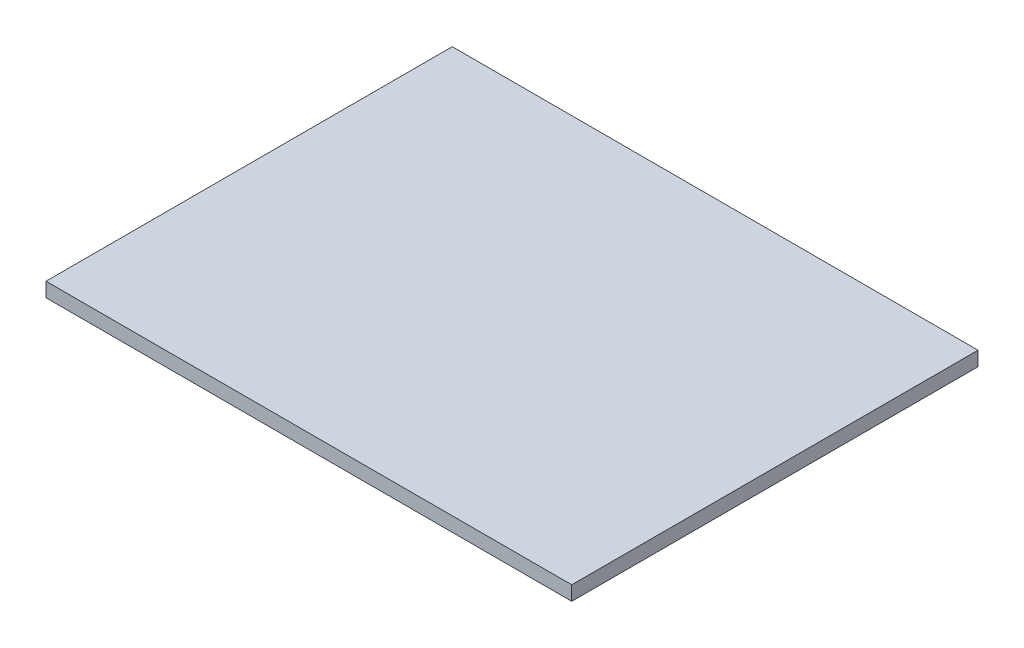
ISO-10303-21;
HEADER;
FILE_DESCRIPTION(('STEP AP214'),'2;1');
FILE_NAME('part.step','',(''),(''),'','','');
FILE_SCHEMA(('AUTOMOTIVE_DESIGN { 1 0 10303 214 1 1 1 1 }'));
ENDSEC;
DATA;
#1=APPLICATION_CONTEXT('core data for automotive mechanical design processes');
#2=APPLICATION_PROTOCOL_DEFINITION('international standard','automotive_design',2000,#1);
#3=PRODUCT_CONTEXT('',#1,'mechanical');
#4=PRODUCT('Part','Part','',(#3));
#5=PRODUCT_RELATED_PRODUCT_CATEGORY('part','',(#4));
#6=PRODUCT_DEFINITION_FORMATION('','',#4);
#7=PRODUCT_DEFINITION_CONTEXT('part definition',#1,'design');
#8=PRODUCT_DEFINITION('design','',#6,#7);
#9=PRODUCT_DEFINITION_SHAPE('','',#8);
#10=(LENGTH_UNIT() NAMED_UNIT(*) SI_UNIT(.MILLI.,.METRE.));
#11=(NAMED_UNIT(*) PLANE_ANGLE_UNIT() SI_UNIT($,.RADIAN.));
#12=(NAMED_UNIT(*) SI_UNIT($,.STERADIAN.) SOLID_ANGLE_UNIT());
#13=UNCERTAINTY_MEASURE_WITH_UNIT(LENGTH_MEASURE(1.E-05),#10,'distance_accuracy_value','');
#14=(GEOMETRIC_REPRESENTATION_CONTEXT(3) GLOBAL_UNCERTAINTY_ASSIGNED_CONTEXT((#13)) GLOBAL_UNIT_ASSIGNED_CONTEXT((#10,
#11,#12)) REPRESENTATION_CONTEXT('',''));
#15=CARTESIAN_POINT('',(0.,0.,0.));
#16=DIRECTION('',(0.,0.,1.));
#17=DIRECTION('',(1.,0.,0.));
#18=AXIS2_PLACEMENT_3D('',#15,#16,#17);
#19=CARTESIAN_POINT('',(55.,3.,42.5));
#20=DIRECTION('',(-1.,0.,0.));
#21=DIRECTION('',(0.,0.,1.));
#22=AXIS2_PLACEMENT_3D('',#19,#20,#21);
#23=PLANE('',#22);
#24=DIRECTION('',(0.,0.,-1.));
#25=VECTOR('',#24,1.);
#26=CARTESIAN_POINT('',(55.,0.,42.5));
#27=LINE('',#26,#25);
#28=CARTESIAN_POINT('',(55.,0.,42.5));
#29=VERTEX_POINT('',#28);
#30=CARTESIAN_POINT('',(55.,0.,-42.5));
#31=VERTEX_POINT('',#30);
#32=EDGE_CURVE('E96',#29,#31,#27,.T.);
#33=ORIENTED_EDGE('',*,*,#32,.T.);
#34=DIRECTION('',(0.,-1.,0.));
#35=VECTOR('',#34,1.);
#36=CARTESIAN_POINT('',(55.,3.,-42.5));
#37=LINE('',#36,#35);
#38=CARTESIAN_POINT('',(55.,3.,-42.5));
#39=VERTEX_POINT('',#38);
#40=EDGE_CURVE('E11',#39,#31,#37,.T.);
#41=ORIENTED_EDGE('',*,*,#40,.F.);
#42=DIRECTION('',(0.,0.,-1.));
#43=VECTOR('',#42,1.);
#44=CARTESIAN_POINT('',(55.,3.,42.5));
#45=LINE('',#44,#43);
#46=CARTESIAN_POINT('',(55.,3.,42.5));
#47=VERTEX_POINT('',#46);
#48=EDGE_CURVE('E84',#47,#39,#45,.T.);
#49=ORIENTED_EDGE('',*,*,#48,.F.);
#50=DIRECTION('',(0.,-1.,0.));
#51=VECTOR('',#50,1.);
#52=CARTESIAN_POINT('',(55.,3.,42.5));
#53=LINE('',#52,#51);
#54=EDGE_CURVE('E92',#47,#29,#53,.T.);
#55=ORIENTED_EDGE('',*,*,#54,.T.);
#56=EDGE_LOOP('',(#33,#41,#49,#55));
#57=FACE_BOUND('',#56,.T.);
#58=ADVANCED_FACE('F33',(#57),#23,.F.);
#59=CARTESIAN_POINT('',(-55.,3.,-42.5));
#60=DIRECTION('',(0.,0.,1.));
#61=DIRECTION('',(1.,0.,0.));
#62=AXIS2_PLACEMENT_3D('',#59,#60,#61);
#63=PLANE('',#62);
#64=DIRECTION('',(-1.,0.,0.));
#65=VECTOR('',#64,1.);
#66=CARTESIAN_POINT('',(-55.,0.,-42.5));
#67=LINE('',#66,#65);
#68=CARTESIAN_POINT('',(-55.,0.,-42.5));
#69=VERTEX_POINT('',#68);
#70=EDGE_CURVE('E88',#31,#69,#67,.T.);
#71=ORIENTED_EDGE('',*,*,#70,.T.);
#72=DIRECTION('',(0.,-1.,0.));
#73=VECTOR('',#72,1.);
#74=CARTESIAN_POINT('',(-55.,3.,-42.5));
#75=LINE('',#74,#73);
#76=CARTESIAN_POINT('',(-55.,3.,-42.5));
#77=VERTEX_POINT('',#76);
#78=EDGE_CURVE('E41',#77,#69,#75,.T.);
#79=ORIENTED_EDGE('',*,*,#78,.F.);
#80=DIRECTION('',(-1.,0.,0.));
#81=VECTOR('',#80,1.);
#82=CARTESIAN_POINT('',(-55.,3.,-42.5));
#83=LINE('',#82,#81);
#84=EDGE_CURVE('E79',#39,#77,#83,.T.);
#85=ORIENTED_EDGE('',*,*,#84,.F.);
#86=ORIENTED_EDGE('',*,*,#40,.T.);
#87=EDGE_LOOP('',(#71,#79,#85,#86));
#88=FACE_BOUND('',#87,.T.);
#89=ADVANCED_FACE('F87',(#88),#63,.F.);
#90=CARTESIAN_POINT('',(-55.,3.,42.5));
#91=DIRECTION('',(1.,0.,0.));
#92=DIRECTION('',(0.,0.,-1.));
#93=AXIS2_PLACEMENT_3D('',#90,#91,#92);
#94=PLANE('',#93);
#95=DIRECTION('',(0.,0.,1.));
#96=VECTOR('',#95,1.);
#97=CARTESIAN_POINT('',(-55.,0.,42.5));
#98=LINE('',#97,#96);
#99=CARTESIAN_POINT('',(-55.,0.,42.5));
#100=VERTEX_POINT('',#99);
#101=EDGE_CURVE('E66',#69,#100,#98,.T.);
#102=ORIENTED_EDGE('',*,*,#101,.T.);
#103=DIRECTION('',(0.,-1.,0.));
#104=VECTOR('',#103,1.);
#105=CARTESIAN_POINT('',(-55.,3.,42.5));
#106=LINE('',#105,#104);
#107=CARTESIAN_POINT('',(-55.,3.,42.5));
#108=VERTEX_POINT('',#107);
#109=EDGE_CURVE('E89',#108,#100,#106,.T.);
#110=ORIENTED_EDGE('',*,*,#109,.F.);
#111=DIRECTION('',(0.,0.,1.));
#112=VECTOR('',#111,1.);
#113=CARTESIAN_POINT('',(-55.,3.,42.5));
#114=LINE('',#113,#112);
#115=EDGE_CURVE('E82',#77,#108,#114,.T.);
#116=ORIENTED_EDGE('',*,*,#115,.F.);
#117=ORIENTED_EDGE('',*,*,#78,.T.);
#118=EDGE_LOOP('',(#102,#110,#116,#117));
#119=FACE_BOUND('',#118,.T.);
#120=ADVANCED_FACE('F90',(#119),#94,.F.);
#121=CARTESIAN_POINT('',(-55.,3.,42.5));
#122=DIRECTION('',(0.,0.,-1.));
#123=DIRECTION('',(-1.,0.,0.));
#124=AXIS2_PLACEMENT_3D('',#121,#122,#123);
#125=PLANE('',#124);
#126=DIRECTION('',(1.,0.,0.));
#127=VECTOR('',#126,1.);
#128=CARTESIAN_POINT('',(-55.,0.,42.5));
#129=LINE('',#128,#127);
#130=EDGE_CURVE('E72',#100,#29,#129,.T.);
#131=ORIENTED_EDGE('',*,*,#130,.T.);
#132=ORIENTED_EDGE('',*,*,#54,.F.);
#133=DIRECTION('',(1.,0.,0.));
#134=VECTOR('',#133,1.);
#135=CARTESIAN_POINT('',(-55.,3.,42.5));
#136=LINE('',#135,#134);
#137=EDGE_CURVE('E49',#108,#47,#136,.T.);
#138=ORIENTED_EDGE('',*,*,#137,.F.);
#139=ORIENTED_EDGE('',*,*,#109,.T.);
#140=EDGE_LOOP('',(#131,#132,#138,#139));
#141=FACE_BOUND('',#140,.T.);
#142=ADVANCED_FACE('F103',(#141),#125,.F.);
#143=CARTESIAN_POINT('',(0.,3.,0.));
#144=DIRECTION('',(0.,-1.,0.));
#145=DIRECTION('',(0.,0.,-1.));
#146=AXIS2_PLACEMENT_3D('',#143,#144,#145);
#147=PLANE('',#146);
#148=ORIENTED_EDGE('',*,*,#48,.T.);
#149=ORIENTED_EDGE('',*,*,#84,.T.);
#150=ORIENTED_EDGE('',*,*,#115,.T.);
#151=ORIENTED_EDGE('',*,*,#137,.T.);
#152=EDGE_LOOP('',(#148,#149,#150,#151));
#153=FACE_BOUND('',#152,.T.);
#154=ADVANCED_FACE('F80',(#153),#147,.F.);
#155=CARTESIAN_POINT('',(0.,0.,0.));
#156=DIRECTION('',(0.,-1.,0.));
#157=DIRECTION('',(0.,0.,-1.));
#158=AXIS2_PLACEMENT_3D('',#155,#156,#157);
#159=PLANE('',#158);
#160=ORIENTED_EDGE('',*,*,#32,.F.);
#161=ORIENTED_EDGE('',*,*,#130,.F.);
#162=ORIENTED_EDGE('',*,*,#101,.F.);
#163=ORIENTED_EDGE('',*,*,#70,.F.);
#164=EDGE_LOOP('',(#160,#161,#162,#163));
#165=FACE_BOUND('',#164,.T.);
#166=ADVANCED_FACE('F106',(#165),#159,.T.);
#167=CLOSED_SHELL('',(#58,#89,#120,#142,#154,#166));
#168=MANIFOLD_SOLID_BREP('B2',#167);
#169=ADVANCED_BREP_SHAPE_REPRESENTATION('',(#18,#168),#14);
#170=SHAPE_DEFINITION_REPRESENTATION(#9,#169);
ENDSEC;
END-ISO-10303-21;
